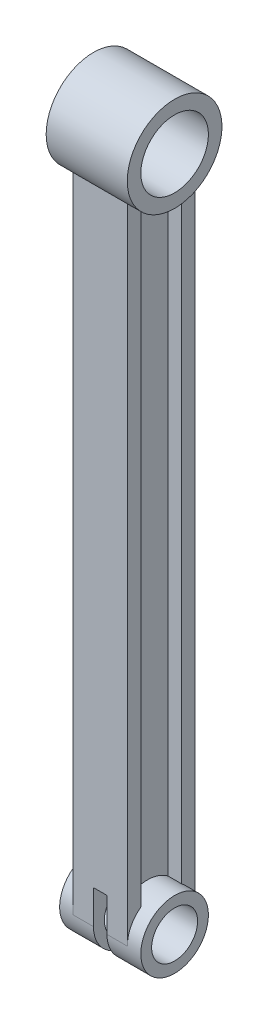
ISO-10303-21;
HEADER;
FILE_DESCRIPTION(('STEP AP214'),'2;1');
FILE_NAME('part.step','',(''),(''),'','','');
FILE_SCHEMA(('AUTOMOTIVE_DESIGN { 1 0 10303 214 1 1 1 1 }'));
ENDSEC;
DATA;
#1=APPLICATION_CONTEXT('core data for automotive mechanical design processes');
#2=APPLICATION_PROTOCOL_DEFINITION('international standard','automotive_design',2000,#1);
#3=PRODUCT_CONTEXT('',#1,'mechanical');
#4=PRODUCT('Part','Part','',(#3));
#5=PRODUCT_RELATED_PRODUCT_CATEGORY('part','',(#4));
#6=PRODUCT_DEFINITION_FORMATION('','',#4);
#7=PRODUCT_DEFINITION_CONTEXT('part definition',#1,'design');
#8=PRODUCT_DEFINITION('design','',#6,#7);
#9=PRODUCT_DEFINITION_SHAPE('','',#8);
#10=(LENGTH_UNIT() NAMED_UNIT(*) SI_UNIT(.MILLI.,.METRE.));
#11=(NAMED_UNIT(*) PLANE_ANGLE_UNIT() SI_UNIT($,.RADIAN.));
#12=(NAMED_UNIT(*) SI_UNIT($,.STERADIAN.) SOLID_ANGLE_UNIT());
#13=UNCERTAINTY_MEASURE_WITH_UNIT(LENGTH_MEASURE(1.E-05),#10,'distance_accuracy_value','');
#14=(GEOMETRIC_REPRESENTATION_CONTEXT(3) GLOBAL_UNCERTAINTY_ASSIGNED_CONTEXT((#13)) GLOBAL_UNIT_ASSIGNED_CONTEXT((#10,
#11,#12)) REPRESENTATION_CONTEXT('',''));
#15=CARTESIAN_POINT('',(0.,0.,0.));
#16=DIRECTION('',(0.,0.,1.));
#17=DIRECTION('',(1.,0.,0.));
#18=AXIS2_PLACEMENT_3D('',#15,#16,#17);
#19=CARTESIAN_POINT('',(-10.,0.,-7.5));
#20=DIRECTION('',(1.,0.,0.));
#21=DIRECTION('',(0.,0.,-1.));
#22=AXIS2_PLACEMENT_3D('',#19,#20,#21);
#23=CYLINDRICAL_SURFACE('',#22,12.5);
#24=CARTESIAN_POINT('',(2.5,0.,-7.5));
#25=DIRECTION('',(-1.,0.,0.));
#26=DIRECTION('',(0.,0.,1.));
#27=AXIS2_PLACEMENT_3D('',#24,#25,#26);
#28=CIRCLE('',#27,12.5);
#29=CARTESIAN_POINT('',(2.5,0.,5.00000000000001));
#30=VERTEX_POINT('',#29);
#31=CARTESIAN_POINT('',(2.5,0.,-20.));
#32=VERTEX_POINT('',#31);
#33=EDGE_CURVE('E298',#30,#32,#28,.F.);
#34=ORIENTED_EDGE('',*,*,#33,.F.);
#35=DIRECTION('',(1.,0.,0.));
#36=VECTOR('',#35,1.);
#37=CARTESIAN_POINT('',(-5.,0.,5.));
#38=LINE('',#37,#36);
#39=CARTESIAN_POINT('',(-5.,0.,5.));
#40=VERTEX_POINT('',#39);
#41=EDGE_CURVE('E263',#40,#30,#38,.T.);
#42=ORIENTED_EDGE('',*,*,#41,.F.);
#43=CARTESIAN_POINT('',(-5.,0.,-7.5));
#44=DIRECTION('',(1.,0.,0.));
#45=DIRECTION('',(0.,0.,-1.));
#46=AXIS2_PLACEMENT_3D('',#43,#44,#45);
#47=CIRCLE('',#46,12.5);
#48=CARTESIAN_POINT('',(-5.,10.,0.));
#49=VERTEX_POINT('',#48);
#50=EDGE_CURVE('E244',#49,#40,#47,.T.);
#51=ORIENTED_EDGE('',*,*,#50,.F.);
#52=DIRECTION('',(1.,0.,0.));
#53=VECTOR('',#52,1.);
#54=CARTESIAN_POINT('',(-10.,10.,0.));
#55=LINE('',#54,#53);
#56=CARTESIAN_POINT('',(0.,10.,0.));
#57=VERTEX_POINT('',#56);
#58=EDGE_CURVE('E241',#57,#49,#55,.F.);
#59=ORIENTED_EDGE('',*,*,#58,.F.);
#60=CARTESIAN_POINT('',(0.,0.,-7.5));
#61=DIRECTION('',(1.,0.,0.));
#62=DIRECTION('',(0.,0.,-1.));
#63=AXIS2_PLACEMENT_3D('',#60,#61,#62);
#64=CIRCLE('',#63,12.5);
#65=CARTESIAN_POINT('',(0.,10.,-15.));
#66=VERTEX_POINT('',#65);
#67=EDGE_CURVE('E238',#66,#57,#64,.T.);
#68=ORIENTED_EDGE('',*,*,#67,.F.);
#69=DIRECTION('',(1.,0.,0.));
#70=VECTOR('',#69,1.);
#71=CARTESIAN_POINT('',(-10.,10.,-15.));
#72=LINE('',#71,#70);
#73=CARTESIAN_POINT('',(-5.,10.,-15.));
#74=VERTEX_POINT('',#73);
#75=EDGE_CURVE('E235',#74,#66,#72,.T.);
#76=ORIENTED_EDGE('',*,*,#75,.F.);
#77=CARTESIAN_POINT('',(-5.,0.,-7.5));
#78=DIRECTION('',(1.,0.,0.));
#79=DIRECTION('',(0.,0.,-1.));
#80=AXIS2_PLACEMENT_3D('',#77,#78,#79);
#81=CIRCLE('',#80,12.5);
#82=CARTESIAN_POINT('',(-5.,0.,-20.));
#83=VERTEX_POINT('',#82);
#84=EDGE_CURVE('E232',#83,#74,#81,.T.);
#85=ORIENTED_EDGE('',*,*,#84,.F.);
#86=DIRECTION('',(-1.,0.,0.));
#87=VECTOR('',#86,1.);
#88=CARTESIAN_POINT('',(-5.,0.,-20.));
#89=LINE('',#88,#87);
#90=EDGE_CURVE('E265',#32,#83,#89,.T.);
#91=ORIENTED_EDGE('',*,*,#90,.F.);
#92=EDGE_LOOP('',(#34,#42,#51,#59,#68,#76,#85,#91));
#93=FACE_BOUND('',#92,.T.);
#94=CARTESIAN_POINT('',(-10.,0.,-7.5));
#95=DIRECTION('',(1.,0.,0.));
#96=DIRECTION('',(0.,0.,-1.));
#97=AXIS2_PLACEMENT_3D('',#94,#95,#96);
#98=CIRCLE('',#97,12.5);
#99=CARTESIAN_POINT('',(-10.,0.,-20.));
#100=VERTEX_POINT('',#99);
#101=EDGE_CURVE('E229',#100,#100,#98,.T.);
#102=ORIENTED_EDGE('',*,*,#101,.T.);
#103=EDGE_LOOP('',(#102));
#104=FACE_BOUND('',#103,.T.);
#105=ADVANCED_FACE('F38',(#93,#104),#23,.T.);
#106=CARTESIAN_POINT('',(-10.,0.,-7.5));
#107=DIRECTION('',(1.,0.,0.));
#108=DIRECTION('',(0.,0.,-1.));
#109=AXIS2_PLACEMENT_3D('',#106,#107,#108);
#110=CYLINDRICAL_SURFACE('',#109,8.5);
#111=CARTESIAN_POINT('',(2.5,0.,-7.5));
#112=DIRECTION('',(-1.,0.,0.));
#113=DIRECTION('',(0.,0.,1.));
#114=AXIS2_PLACEMENT_3D('',#111,#112,#113);
#115=CIRCLE('',#114,8.5);
#116=CARTESIAN_POINT('',(2.5,0.,1.));
#117=VERTEX_POINT('',#116);
#118=EDGE_CURVE('E157',#117,#117,#115,.F.);
#119=ORIENTED_EDGE('',*,*,#118,.T.);
#120=EDGE_LOOP('',(#119));
#121=FACE_BOUND('',#120,.T.);
#122=CARTESIAN_POINT('',(-10.,0.,-7.5));
#123=DIRECTION('',(1.,0.,0.));
#124=DIRECTION('',(0.,0.,-1.));
#125=AXIS2_PLACEMENT_3D('',#122,#123,#124);
#126=CIRCLE('',#125,8.5);
#127=CARTESIAN_POINT('',(-10.,0.,-16.));
#128=VERTEX_POINT('',#127);
#129=EDGE_CURVE('E221',#128,#128,#126,.T.);
#130=ORIENTED_EDGE('',*,*,#129,.F.);
#131=EDGE_LOOP('',(#130));
#132=FACE_BOUND('',#131,.T.);
#133=ADVANCED_FACE('F376',(#121,#132),#110,.F.);
#134=CARTESIAN_POINT('',(-5.,250.,0.));
#135=DIRECTION('',(0.,0.,1.));
#136=DIRECTION('',(1.,0.,0.));
#137=AXIS2_PLACEMENT_3D('',#134,#135,#136);
#138=PLANE('',#137);
#139=DIRECTION('',(0.,-1.,0.));
#140=VECTOR('',#139,1.);
#141=CARTESIAN_POINT('',(-5.,250.,0.));
#142=LINE('',#141,#140);
#143=CARTESIAN_POINT('',(-5.,234.188611699158,0.));
#144=VERTEX_POINT('',#143);
#145=EDGE_CURVE('E293',#144,#49,#142,.T.);
#146=ORIENTED_EDGE('',*,*,#145,.F.);
#147=DIRECTION('',(-1.,0.,0.));
#148=VECTOR('',#147,1.);
#149=CARTESIAN_POINT('',(20.,234.188611699158,0.));
#150=LINE('',#149,#148);
#151=CARTESIAN_POINT('',(0.,234.188611699158,0.));
#152=VERTEX_POINT('',#151);
#153=EDGE_CURVE('E217',#144,#152,#150,.F.);
#154=ORIENTED_EDGE('',*,*,#153,.T.);
#155=DIRECTION('',(0.,-1.,0.));
#156=VECTOR('',#155,1.);
#157=CARTESIAN_POINT('',(0.,250.,0.));
#158=LINE('',#157,#156);
#159=EDGE_CURVE('E269',#152,#57,#158,.T.);
#160=ORIENTED_EDGE('',*,*,#159,.T.);
#161=ORIENTED_EDGE('',*,*,#58,.T.);
#162=EDGE_LOOP('',(#146,#154,#160,#161));
#163=FACE_BOUND('',#162,.T.);
#164=ADVANCED_FACE('F40',(#163),#138,.F.);
#165=CARTESIAN_POINT('',(-5.,250.,0.));
#166=DIRECTION('',(1.,0.,0.));
#167=DIRECTION('',(0.,0.,-1.));
#168=AXIS2_PLACEMENT_3D('',#165,#166,#167);
#169=PLANE('',#168);
#170=DIRECTION('',(0.,-1.,0.));
#171=VECTOR('',#170,1.);
#172=CARTESIAN_POINT('',(-5.,250.,5.));
#173=LINE('',#172,#171);
#174=CARTESIAN_POINT('',(-5.,237.752551286084,5.));
#175=VERTEX_POINT('',#174);
#176=EDGE_CURVE('E291',#175,#40,#173,.T.);
#177=ORIENTED_EDGE('',*,*,#176,.F.);
#178=CARTESIAN_POINT('',(-5.,250.,-7.5));
#179=DIRECTION('',(1.,0.,0.));
#180=DIRECTION('',(0.,0.,-1.));
#181=AXIS2_PLACEMENT_3D('',#178,#179,#180);
#182=CIRCLE('',#181,17.5);
#183=EDGE_CURVE('E214',#175,#144,#182,.T.);
#184=ORIENTED_EDGE('',*,*,#183,.T.);
#185=ORIENTED_EDGE('',*,*,#145,.T.);
#186=ORIENTED_EDGE('',*,*,#50,.T.);
#187=EDGE_LOOP('',(#177,#184,#185,#186));
#188=FACE_BOUND('',#187,.T.);
#189=ADVANCED_FACE('F340',(#188),#169,.F.);
#190=CARTESIAN_POINT('',(-5.,250.,5.));
#191=DIRECTION('',(0.,0.,-1.));
#192=DIRECTION('',(-1.,0.,0.));
#193=AXIS2_PLACEMENT_3D('',#190,#191,#192);
#194=PLANE('',#193);
#195=ORIENTED_EDGE('',*,*,#41,.T.);
#196=DIRECTION('',(0.,1.,0.));
#197=VECTOR('',#196,1.);
#198=CARTESIAN_POINT('',(2.5,250.,5.));
#199=LINE('',#198,#197);
#200=CARTESIAN_POINT('',(2.5,12.5,5.));
#201=VERTEX_POINT('',#200);
#202=EDGE_CURVE('E171',#30,#201,#199,.T.);
#203=ORIENTED_EDGE('',*,*,#202,.T.);
#204=DIRECTION('',(-1.,0.,0.));
#205=VECTOR('',#204,1.);
#206=CARTESIAN_POINT('',(-5.,12.5,5.));
#207=LINE('',#206,#205);
#208=CARTESIAN_POINT('',(7.5,12.5,5.));
#209=VERTEX_POINT('',#208);
#210=EDGE_CURVE('E162',#209,#201,#207,.T.);
#211=ORIENTED_EDGE('',*,*,#210,.F.);
#212=DIRECTION('',(0.,-1.,0.));
#213=VECTOR('',#212,1.);
#214=CARTESIAN_POINT('',(7.5,250.,5.));
#215=LINE('',#214,#213);
#216=CARTESIAN_POINT('',(7.5,0.,5.));
#217=VERTEX_POINT('',#216);
#218=EDGE_CURVE('E149',#209,#217,#215,.T.);
#219=ORIENTED_EDGE('',*,*,#218,.T.);
#220=CARTESIAN_POINT('',(15.,0.,5.));
#221=VERTEX_POINT('',#220);
#222=EDGE_CURVE('E262',#217,#221,#38,.T.);
#223=ORIENTED_EDGE('',*,*,#222,.T.);
#224=DIRECTION('',(0.,-1.,0.));
#225=VECTOR('',#224,1.);
#226=CARTESIAN_POINT('',(15.,250.,5.));
#227=LINE('',#226,#225);
#228=CARTESIAN_POINT('',(15.,237.752551286084,5.));
#229=VERTEX_POINT('',#228);
#230=EDGE_CURVE('E288',#229,#221,#227,.T.);
#231=ORIENTED_EDGE('',*,*,#230,.F.);
#232=DIRECTION('',(-1.,0.,0.));
#233=VECTOR('',#232,1.);
#234=CARTESIAN_POINT('',(20.,237.752551286084,5.));
#235=LINE('',#234,#233);
#236=EDGE_CURVE('E211',#229,#175,#235,.T.);
#237=ORIENTED_EDGE('',*,*,#236,.T.);
#238=ORIENTED_EDGE('',*,*,#176,.T.);
#239=EDGE_LOOP('',(#195,#203,#211,#219,#223,#231,#237,#238));
#240=FACE_BOUND('',#239,.T.);
#241=ADVANCED_FACE('F170',(#240),#194,.F.);
#242=CARTESIAN_POINT('',(15.,250.,0.));
#243=DIRECTION('',(-1.,0.,0.));
#244=DIRECTION('',(0.,0.,1.));
#245=AXIS2_PLACEMENT_3D('',#242,#243,#244);
#246=PLANE('',#245);
#247=DIRECTION('',(0.,-1.,0.));
#248=VECTOR('',#247,1.);
#249=CARTESIAN_POINT('',(15.,250.,0.));
#250=LINE('',#249,#248);
#251=CARTESIAN_POINT('',(15.,234.188611699158,0.));
#252=VERTEX_POINT('',#251);
#253=CARTESIAN_POINT('',(15.,10.,0.));
#254=VERTEX_POINT('',#253);
#255=EDGE_CURVE('E286',#252,#254,#250,.T.);
#256=ORIENTED_EDGE('',*,*,#255,.F.);
#257=CARTESIAN_POINT('',(15.,250.,-7.5));
#258=DIRECTION('',(-1.,0.,0.));
#259=DIRECTION('',(0.,0.,1.));
#260=AXIS2_PLACEMENT_3D('',#257,#258,#259);
#261=CIRCLE('',#260,17.5);
#262=EDGE_CURVE('E208',#252,#229,#261,.T.);
#263=ORIENTED_EDGE('',*,*,#262,.T.);
#264=ORIENTED_EDGE('',*,*,#230,.T.);
#265=CARTESIAN_POINT('',(15.,0.,-7.5));
#266=DIRECTION('',(-1.,0.,0.));
#267=DIRECTION('',(0.,0.,1.));
#268=AXIS2_PLACEMENT_3D('',#265,#266,#267);
#269=CIRCLE('',#268,12.5);
#270=EDGE_CURVE('E247',#221,#254,#269,.T.);
#271=ORIENTED_EDGE('',*,*,#270,.T.);
#272=EDGE_LOOP('',(#256,#263,#264,#271));
#273=FACE_BOUND('',#272,.T.);
#274=ADVANCED_FACE('F335',(#273),#246,.F.);
#275=CARTESIAN_POINT('',(10.,250.,0.));
#276=DIRECTION('',(0.,0.,1.));
#277=DIRECTION('',(1.,0.,0.));
#278=AXIS2_PLACEMENT_3D('',#275,#276,#277);
#279=PLANE('',#278);
#280=DIRECTION('',(0.,-1.,0.));
#281=VECTOR('',#280,1.);
#282=CARTESIAN_POINT('',(10.,250.,0.));
#283=LINE('',#282,#281);
#284=CARTESIAN_POINT('',(10.,234.188611699158,0.));
#285=VERTEX_POINT('',#284);
#286=CARTESIAN_POINT('',(10.,10.,0.));
#287=VERTEX_POINT('',#286);
#288=EDGE_CURVE('E284',#285,#287,#283,.T.);
#289=ORIENTED_EDGE('',*,*,#288,.F.);
#290=DIRECTION('',(-1.,0.,0.));
#291=VECTOR('',#290,1.);
#292=CARTESIAN_POINT('',(20.,234.188611699158,0.));
#293=LINE('',#292,#291);
#294=EDGE_CURVE('E205',#285,#252,#293,.F.);
#295=ORIENTED_EDGE('',*,*,#294,.T.);
#296=ORIENTED_EDGE('',*,*,#255,.T.);
#297=DIRECTION('',(1.,0.,0.));
#298=VECTOR('',#297,1.);
#299=CARTESIAN_POINT('',(-9.99999999999999,10.,0.));
#300=LINE('',#299,#298);
#301=EDGE_CURVE('E250',#254,#287,#300,.F.);
#302=ORIENTED_EDGE('',*,*,#301,.T.);
#303=EDGE_LOOP('',(#289,#295,#296,#302));
#304=FACE_BOUND('',#303,.T.);
#305=ADVANCED_FACE('F331',(#304),#279,.F.);
#306=CARTESIAN_POINT('',(10.,250.,-15.));
#307=DIRECTION('',(-1.,0.,0.));
#308=DIRECTION('',(0.,0.,1.));
#309=AXIS2_PLACEMENT_3D('',#306,#307,#308);
#310=PLANE('',#309);
#311=DIRECTION('',(0.,-1.,0.));
#312=VECTOR('',#311,1.);
#313=CARTESIAN_POINT('',(10.,250.,-15.));
#314=LINE('',#313,#312);
#315=CARTESIAN_POINT('',(10.,234.188611699158,-15.));
#316=VERTEX_POINT('',#315);
#317=CARTESIAN_POINT('',(10.,10.,-15.));
#318=VERTEX_POINT('',#317);
#319=EDGE_CURVE('E282',#316,#318,#314,.T.);
#320=ORIENTED_EDGE('',*,*,#319,.F.);
#321=CARTESIAN_POINT('',(10.,250.,-7.5));
#322=DIRECTION('',(-1.,0.,0.));
#323=DIRECTION('',(0.,0.,1.));
#324=AXIS2_PLACEMENT_3D('',#321,#322,#323);
#325=CIRCLE('',#324,17.5);
#326=EDGE_CURVE('E202',#316,#285,#325,.T.);
#327=ORIENTED_EDGE('',*,*,#326,.T.);
#328=ORIENTED_EDGE('',*,*,#288,.T.);
#329=CARTESIAN_POINT('',(10.,0.,-7.5));
#330=DIRECTION('',(-1.,0.,0.));
#331=DIRECTION('',(0.,0.,1.));
#332=AXIS2_PLACEMENT_3D('',#329,#330,#331);
#333=CIRCLE('',#332,12.5);
#334=EDGE_CURVE('E253',#287,#318,#333,.T.);
#335=ORIENTED_EDGE('',*,*,#334,.T.);
#336=EDGE_LOOP('',(#320,#327,#328,#335));
#337=FACE_BOUND('',#336,.T.);
#338=ADVANCED_FACE('F328',(#337),#310,.F.);
#339=CARTESIAN_POINT('',(10.,250.,-15.));
#340=DIRECTION('',(0.,0.,-1.));
#341=DIRECTION('',(-1.,0.,0.));
#342=AXIS2_PLACEMENT_3D('',#339,#340,#341);
#343=PLANE('',#342);
#344=DIRECTION('',(0.,-1.,0.));
#345=VECTOR('',#344,1.);
#346=CARTESIAN_POINT('',(15.,250.,-15.));
#347=LINE('',#346,#345);
#348=CARTESIAN_POINT('',(15.,234.188611699158,-15.));
#349=VERTEX_POINT('',#348);
#350=CARTESIAN_POINT('',(15.,10.,-15.));
#351=VERTEX_POINT('',#350);
#352=EDGE_CURVE('E280',#349,#351,#347,.T.);
#353=ORIENTED_EDGE('',*,*,#352,.F.);
#354=DIRECTION('',(-1.,0.,0.));
#355=VECTOR('',#354,1.);
#356=CARTESIAN_POINT('',(20.,234.188611699158,-15.));
#357=LINE('',#356,#355);
#358=EDGE_CURVE('E199',#349,#316,#357,.T.);
#359=ORIENTED_EDGE('',*,*,#358,.T.);
#360=ORIENTED_EDGE('',*,*,#319,.T.);
#361=DIRECTION('',(1.,0.,0.));
#362=VECTOR('',#361,1.);
#363=CARTESIAN_POINT('',(-10.,10.,-15.));
#364=LINE('',#363,#362);
#365=EDGE_CURVE('E256',#318,#351,#364,.T.);
#366=ORIENTED_EDGE('',*,*,#365,.T.);
#367=EDGE_LOOP('',(#353,#359,#360,#366));
#368=FACE_BOUND('',#367,.T.);
#369=ADVANCED_FACE('F323',(#368),#343,.F.);
#370=CARTESIAN_POINT('',(15.,250.,-15.));
#371=DIRECTION('',(-1.,0.,0.));
#372=DIRECTION('',(0.,0.,1.));
#373=AXIS2_PLACEMENT_3D('',#370,#371,#372);
#374=PLANE('',#373);
#375=DIRECTION('',(0.,-1.,0.));
#376=VECTOR('',#375,1.);
#377=CARTESIAN_POINT('',(15.,250.,-20.));
#378=LINE('',#377,#376);
#379=CARTESIAN_POINT('',(15.,237.752551286084,-20.));
#380=VERTEX_POINT('',#379);
#381=CARTESIAN_POINT('',(15.,0.,-20.));
#382=VERTEX_POINT('',#381);
#383=EDGE_CURVE('E278',#380,#382,#378,.T.);
#384=ORIENTED_EDGE('',*,*,#383,.F.);
#385=CARTESIAN_POINT('',(15.,250.,-7.5));
#386=DIRECTION('',(-1.,0.,0.));
#387=DIRECTION('',(0.,0.,1.));
#388=AXIS2_PLACEMENT_3D('',#385,#386,#387);
#389=CIRCLE('',#388,17.5);
#390=EDGE_CURVE('E196',#380,#349,#389,.T.);
#391=ORIENTED_EDGE('',*,*,#390,.T.);
#392=ORIENTED_EDGE('',*,*,#352,.T.);
#393=CARTESIAN_POINT('',(15.,0.,-7.5));
#394=DIRECTION('',(-1.,0.,0.));
#395=DIRECTION('',(0.,0.,1.));
#396=AXIS2_PLACEMENT_3D('',#393,#394,#395);
#397=CIRCLE('',#396,12.5);
#398=EDGE_CURVE('E259',#351,#382,#397,.T.);
#399=ORIENTED_EDGE('',*,*,#398,.T.);
#400=EDGE_LOOP('',(#384,#391,#392,#399));
#401=FACE_BOUND('',#400,.T.);
#402=ADVANCED_FACE('F320',(#401),#374,.F.);
#403=CARTESIAN_POINT('',(-5.,250.,-20.));
#404=DIRECTION('',(0.,0.,1.));
#405=DIRECTION('',(1.,0.,0.));
#406=AXIS2_PLACEMENT_3D('',#403,#404,#405);
#407=PLANE('',#406);
#408=DIRECTION('',(1.,0.,0.));
#409=VECTOR('',#408,1.);
#410=CARTESIAN_POINT('',(-5.,12.5,-20.));
#411=LINE('',#410,#409);
#412=CARTESIAN_POINT('',(2.5,12.5,-20.));
#413=VERTEX_POINT('',#412);
#414=CARTESIAN_POINT('',(7.5,12.5,-20.));
#415=VERTEX_POINT('',#414);
#416=EDGE_CURVE('E11',#413,#415,#411,.T.);
#417=ORIENTED_EDGE('',*,*,#416,.F.);
#418=DIRECTION('',(0.,-1.,0.));
#419=VECTOR('',#418,1.);
#420=CARTESIAN_POINT('',(2.5,250.,-20.));
#421=LINE('',#420,#419);
#422=EDGE_CURVE('E177',#413,#32,#421,.T.);
#423=ORIENTED_EDGE('',*,*,#422,.T.);
#424=ORIENTED_EDGE('',*,*,#90,.T.);
#425=DIRECTION('',(0.,-1.,0.));
#426=VECTOR('',#425,1.);
#427=CARTESIAN_POINT('',(-5.,250.,-20.));
#428=LINE('',#427,#426);
#429=CARTESIAN_POINT('',(-5.,237.752551286084,-20.));
#430=VERTEX_POINT('',#429);
#431=EDGE_CURVE('E275',#430,#83,#428,.T.);
#432=ORIENTED_EDGE('',*,*,#431,.F.);
#433=DIRECTION('',(-1.,0.,0.));
#434=VECTOR('',#433,1.);
#435=CARTESIAN_POINT('',(20.,237.752551286084,-20.));
#436=LINE('',#435,#434);
#437=EDGE_CURVE('E193',#430,#380,#436,.F.);
#438=ORIENTED_EDGE('',*,*,#437,.T.);
#439=ORIENTED_EDGE('',*,*,#383,.T.);
#440=CARTESIAN_POINT('',(7.5,0.,-20.));
#441=VERTEX_POINT('',#440);
#442=EDGE_CURVE('E266',#382,#441,#89,.T.);
#443=ORIENTED_EDGE('',*,*,#442,.T.);
#444=DIRECTION('',(0.,1.,0.));
#445=VECTOR('',#444,1.);
#446=CARTESIAN_POINT('',(7.5,250.,-20.));
#447=LINE('',#446,#445);
#448=EDGE_CURVE('E53',#441,#415,#447,.T.);
#449=ORIENTED_EDGE('',*,*,#448,.T.);
#450=EDGE_LOOP('',(#417,#423,#424,#432,#438,#439,#443,#449));
#451=FACE_BOUND('',#450,.T.);
#452=ADVANCED_FACE('F310',(#451),#407,.F.);
#453=CARTESIAN_POINT('',(-5.,250.,-15.));
#454=DIRECTION('',(1.,0.,0.));
#455=DIRECTION('',(0.,0.,-1.));
#456=AXIS2_PLACEMENT_3D('',#453,#454,#455);
#457=PLANE('',#456);
#458=DIRECTION('',(0.,-1.,0.));
#459=VECTOR('',#458,1.);
#460=CARTESIAN_POINT('',(-5.,250.,-15.));
#461=LINE('',#460,#459);
#462=CARTESIAN_POINT('',(-5.,234.188611699158,-15.));
#463=VERTEX_POINT('',#462);
#464=EDGE_CURVE('E273',#463,#74,#461,.T.);
#465=ORIENTED_EDGE('',*,*,#464,.F.);
#466=CARTESIAN_POINT('',(-5.,250.,-7.5));
#467=DIRECTION('',(1.,0.,0.));
#468=DIRECTION('',(0.,0.,-1.));
#469=AXIS2_PLACEMENT_3D('',#466,#467,#468);
#470=CIRCLE('',#469,17.5);
#471=EDGE_CURVE('E190',#463,#430,#470,.T.);
#472=ORIENTED_EDGE('',*,*,#471,.T.);
#473=ORIENTED_EDGE('',*,*,#431,.T.);
#474=ORIENTED_EDGE('',*,*,#84,.T.);
#475=EDGE_LOOP('',(#465,#472,#473,#474));
#476=FACE_BOUND('',#475,.T.);
#477=ADVANCED_FACE('F358',(#476),#457,.F.);
#478=CARTESIAN_POINT('',(-5.,250.,-15.));
#479=DIRECTION('',(0.,0.,-1.));
#480=DIRECTION('',(-1.,0.,0.));
#481=AXIS2_PLACEMENT_3D('',#478,#479,#480);
#482=PLANE('',#481);
#483=DIRECTION('',(0.,-1.,0.));
#484=VECTOR('',#483,1.);
#485=CARTESIAN_POINT('',(0.,250.,-15.));
#486=LINE('',#485,#484);
#487=CARTESIAN_POINT('',(0.,234.188611699158,-15.));
#488=VERTEX_POINT('',#487);
#489=EDGE_CURVE('E271',#488,#66,#486,.T.);
#490=ORIENTED_EDGE('',*,*,#489,.F.);
#491=DIRECTION('',(-1.,0.,0.));
#492=VECTOR('',#491,1.);
#493=CARTESIAN_POINT('',(20.,234.188611699158,-15.));
#494=LINE('',#493,#492);
#495=EDGE_CURVE('E61',#488,#463,#494,.T.);
#496=ORIENTED_EDGE('',*,*,#495,.T.);
#497=ORIENTED_EDGE('',*,*,#464,.T.);
#498=ORIENTED_EDGE('',*,*,#75,.T.);
#499=EDGE_LOOP('',(#490,#496,#497,#498));
#500=FACE_BOUND('',#499,.T.);
#501=ADVANCED_FACE('F355',(#500),#482,.F.);
#502=CARTESIAN_POINT('',(0.,250.,0.));
#503=DIRECTION('',(1.,0.,0.));
#504=DIRECTION('',(0.,0.,-1.));
#505=AXIS2_PLACEMENT_3D('',#502,#503,#504);
#506=PLANE('',#505);
#507=ORIENTED_EDGE('',*,*,#159,.F.);
#508=CARTESIAN_POINT('',(0.,250.,-7.5));
#509=DIRECTION('',(1.,0.,0.));
#510=DIRECTION('',(0.,0.,-1.));
#511=AXIS2_PLACEMENT_3D('',#508,#509,#510);
#512=CIRCLE('',#511,17.5);
#513=EDGE_CURVE('E46',#152,#488,#512,.T.);
#514=ORIENTED_EDGE('',*,*,#513,.T.);
#515=ORIENTED_EDGE('',*,*,#489,.T.);
#516=ORIENTED_EDGE('',*,*,#67,.T.);
#517=EDGE_LOOP('',(#507,#514,#515,#516));
#518=FACE_BOUND('',#517,.T.);
#519=ADVANCED_FACE('F350',(#518),#506,.F.);
#520=CARTESIAN_POINT('',(7.5,0.,-7.5));
#521=DIRECTION('',(1.,0.,0.));
#522=DIRECTION('',(0.,0.,-1.));
#523=AXIS2_PLACEMENT_3D('',#520,#521,#522);
#524=CIRCLE('',#523,12.5);
#525=EDGE_CURVE('E153',#441,#217,#524,.F.);
#526=ORIENTED_EDGE('',*,*,#525,.F.);
#527=ORIENTED_EDGE('',*,*,#442,.F.);
#528=ORIENTED_EDGE('',*,*,#398,.F.);
#529=ORIENTED_EDGE('',*,*,#365,.F.);
#530=ORIENTED_EDGE('',*,*,#334,.F.);
#531=ORIENTED_EDGE('',*,*,#301,.F.);
#532=ORIENTED_EDGE('',*,*,#270,.F.);
#533=ORIENTED_EDGE('',*,*,#222,.F.);
#534=EDGE_LOOP('',(#526,#527,#528,#529,#530,#531,#532,#533));
#535=FACE_BOUND('',#534,.T.);
#536=CARTESIAN_POINT('',(20.,0.,-7.5));
#537=DIRECTION('',(1.,0.,0.));
#538=DIRECTION('',(0.,0.,-1.));
#539=AXIS2_PLACEMENT_3D('',#536,#537,#538);
#540=CIRCLE('',#539,12.5);
#541=CARTESIAN_POINT('',(20.,0.,-20.));
#542=VERTEX_POINT('',#541);
#543=EDGE_CURVE('E224',#542,#542,#540,.T.);
#544=ORIENTED_EDGE('',*,*,#543,.F.);
#545=EDGE_LOOP('',(#544));
#546=FACE_BOUND('',#545,.T.);
#547=ADVANCED_FACE('F316',(#535,#546),#23,.T.);
#548=CARTESIAN_POINT('',(-10.,0.,-7.5));
#549=DIRECTION('',(1.,0.,0.));
#550=DIRECTION('',(0.,0.,-1.));
#551=AXIS2_PLACEMENT_3D('',#548,#549,#550);
#552=PLANE('',#551);
#553=ORIENTED_EDGE('',*,*,#129,.T.);
#554=EDGE_LOOP('',(#553));
#555=FACE_BOUND('',#554,.T.);
#556=ORIENTED_EDGE('',*,*,#101,.F.);
#557=EDGE_LOOP('',(#556));
#558=FACE_BOUND('',#557,.T.);
#559=ADVANCED_FACE('F387',(#555,#558),#552,.F.);
#560=CARTESIAN_POINT('',(20.,0.,-7.5));
#561=DIRECTION('',(1.,0.,0.));
#562=DIRECTION('',(0.,0.,-1.));
#563=AXIS2_PLACEMENT_3D('',#560,#561,#562);
#564=PLANE('',#563);
#565=CARTESIAN_POINT('',(20.,0.,-7.5));
#566=DIRECTION('',(1.,0.,0.));
#567=DIRECTION('',(0.,0.,-1.));
#568=AXIS2_PLACEMENT_3D('',#565,#566,#567);
#569=CIRCLE('',#568,8.5);
#570=CARTESIAN_POINT('',(20.,0.,-16.));
#571=VERTEX_POINT('',#570);
#572=EDGE_CURVE('E220',#571,#571,#569,.T.);
#573=ORIENTED_EDGE('',*,*,#572,.F.);
#574=EDGE_LOOP('',(#573));
#575=FACE_BOUND('',#574,.T.);
#576=ORIENTED_EDGE('',*,*,#543,.T.);
#577=EDGE_LOOP('',(#576));
#578=FACE_BOUND('',#577,.T.);
#579=ADVANCED_FACE('F373',(#575,#578),#564,.T.);
#580=CARTESIAN_POINT('',(7.5,0.,-7.5));
#581=DIRECTION('',(1.,0.,0.));
#582=DIRECTION('',(0.,0.,-1.));
#583=AXIS2_PLACEMENT_3D('',#580,#581,#582);
#584=CIRCLE('',#583,8.5);
#585=CARTESIAN_POINT('',(7.5,0.,-16.));
#586=VERTEX_POINT('',#585);
#587=EDGE_CURVE('E165',#586,#586,#584,.F.);
#588=ORIENTED_EDGE('',*,*,#587,.T.);
#589=EDGE_LOOP('',(#588));
#590=FACE_BOUND('',#589,.T.);
#591=ORIENTED_EDGE('',*,*,#572,.T.);
#592=EDGE_LOOP('',(#591));
#593=FACE_BOUND('',#592,.T.);
#594=ADVANCED_FACE('F363',(#590,#593),#110,.F.);
#595=CARTESIAN_POINT('',(20.,250.,-7.5));
#596=DIRECTION('',(-1.,0.,0.));
#597=DIRECTION('',(0.,0.,1.));
#598=AXIS2_PLACEMENT_3D('',#595,#596,#597);
#599=CYLINDRICAL_SURFACE('',#598,17.5);
#600=CARTESIAN_POINT('',(-10.,250.,-7.5));
#601=DIRECTION('',(-1.,0.,0.));
#602=DIRECTION('',(0.,0.,1.));
#603=AXIS2_PLACEMENT_3D('',#600,#601,#602);
#604=CIRCLE('',#603,17.5);
#605=CARTESIAN_POINT('',(-10.,250.,10.));
#606=VERTEX_POINT('',#605);
#607=EDGE_CURVE('E182',#606,#606,#604,.T.);
#608=ORIENTED_EDGE('',*,*,#607,.F.);
#609=EDGE_LOOP('',(#608));
#610=FACE_BOUND('',#609,.T.);
#611=CARTESIAN_POINT('',(20.,250.,-7.5));
#612=DIRECTION('',(-1.,0.,0.));
#613=DIRECTION('',(0.,0.,1.));
#614=AXIS2_PLACEMENT_3D('',#611,#612,#613);
#615=CIRCLE('',#614,17.5);
#616=CARTESIAN_POINT('',(20.,250.,10.));
#617=VERTEX_POINT('',#616);
#618=EDGE_CURVE('E186',#617,#617,#615,.T.);
#619=ORIENTED_EDGE('',*,*,#618,.T.);
#620=EDGE_LOOP('',(#619));
#621=FACE_BOUND('',#620,.T.);
#622=ORIENTED_EDGE('',*,*,#153,.F.);
#623=ORIENTED_EDGE('',*,*,#183,.F.);
#624=ORIENTED_EDGE('',*,*,#236,.F.);
#625=ORIENTED_EDGE('',*,*,#262,.F.);
#626=ORIENTED_EDGE('',*,*,#294,.F.);
#627=ORIENTED_EDGE('',*,*,#326,.F.);
#628=ORIENTED_EDGE('',*,*,#358,.F.);
#629=ORIENTED_EDGE('',*,*,#390,.F.);
#630=ORIENTED_EDGE('',*,*,#437,.F.);
#631=ORIENTED_EDGE('',*,*,#471,.F.);
#632=ORIENTED_EDGE('',*,*,#495,.F.);
#633=ORIENTED_EDGE('',*,*,#513,.F.);
#634=EDGE_LOOP('',(#622,#623,#624,#625,#626,#627,#628,#629,#630,#631,#632,#633));
#635=FACE_BOUND('',#634,.T.);
#636=ADVANCED_FACE('F360',(#610,#621,#635),#599,.T.);
#637=CARTESIAN_POINT('',(20.,250.,-7.5));
#638=DIRECTION('',(-1.,0.,0.));
#639=DIRECTION('',(0.,0.,1.));
#640=AXIS2_PLACEMENT_3D('',#637,#638,#639);
#641=PLANE('',#640);
#642=CARTESIAN_POINT('',(20.,250.,-7.5));
#643=DIRECTION('',(1.,0.,0.));
#644=DIRECTION('',(0.,0.,-1.));
#645=AXIS2_PLACEMENT_3D('',#642,#643,#644);
#646=CIRCLE('',#645,12.5);
#647=CARTESIAN_POINT('',(20.,250.,-20.));
#648=VERTEX_POINT('',#647);
#649=EDGE_CURVE('E172',#648,#648,#646,.T.);
#650=ORIENTED_EDGE('',*,*,#649,.F.);
#651=EDGE_LOOP('',(#650));
#652=FACE_BOUND('',#651,.T.);
#653=ORIENTED_EDGE('',*,*,#618,.F.);
#654=EDGE_LOOP('',(#653));
#655=FACE_BOUND('',#654,.T.);
#656=ADVANCED_FACE('F362',(#652,#655),#641,.F.);
#657=CARTESIAN_POINT('',(-10.,250.,-7.5));
#658=DIRECTION('',(-1.,0.,0.));
#659=DIRECTION('',(0.,0.,1.));
#660=AXIS2_PLACEMENT_3D('',#657,#658,#659);
#661=PLANE('',#660);
#662=CARTESIAN_POINT('',(-10.,250.,-7.5));
#663=DIRECTION('',(1.,0.,0.));
#664=DIRECTION('',(0.,0.,-1.));
#665=AXIS2_PLACEMENT_3D('',#662,#663,#664);
#666=CIRCLE('',#665,12.5);
#667=CARTESIAN_POINT('',(-10.,250.,-20.));
#668=VERTEX_POINT('',#667);
#669=EDGE_CURVE('E175',#668,#668,#666,.T.);
#670=ORIENTED_EDGE('',*,*,#669,.T.);
#671=EDGE_LOOP('',(#670));
#672=FACE_BOUND('',#671,.T.);
#673=ORIENTED_EDGE('',*,*,#607,.T.);
#674=EDGE_LOOP('',(#673));
#675=FACE_BOUND('',#674,.T.);
#676=ADVANCED_FACE('F370',(#672,#675),#661,.T.);
#677=CARTESIAN_POINT('',(-10.,250.,-7.5));
#678=DIRECTION('',(1.,0.,0.));
#679=DIRECTION('',(0.,0.,-1.));
#680=AXIS2_PLACEMENT_3D('',#677,#678,#679);
#681=CYLINDRICAL_SURFACE('',#680,12.5);
#682=ORIENTED_EDGE('',*,*,#669,.F.);
#683=EDGE_LOOP('',(#682));
#684=FACE_BOUND('',#683,.T.);
#685=ORIENTED_EDGE('',*,*,#649,.T.);
#686=EDGE_LOOP('',(#685));
#687=FACE_BOUND('',#686,.T.);
#688=ADVANCED_FACE('F468',(#684,#687),#681,.F.);
#689=CARTESIAN_POINT('',(0.,12.5,0.));
#690=DIRECTION('',(0.,-1.,0.));
#691=DIRECTION('',(0.,0.,-1.));
#692=AXIS2_PLACEMENT_3D('',#689,#690,#691);
#693=PLANE('',#692);
#694=ORIENTED_EDGE('',*,*,#210,.T.);
#695=DIRECTION('',(0.,0.,1.));
#696=VECTOR('',#695,1.);
#697=CARTESIAN_POINT('',(2.5,12.5,15.));
#698=LINE('',#697,#696);
#699=EDGE_CURVE('E166',#413,#201,#698,.T.);
#700=ORIENTED_EDGE('',*,*,#699,.F.);
#701=ORIENTED_EDGE('',*,*,#416,.T.);
#702=DIRECTION('',(0.,0.,-1.));
#703=VECTOR('',#702,1.);
#704=CARTESIAN_POINT('',(7.5,12.5,15.));
#705=LINE('',#704,#703);
#706=EDGE_CURVE('E152',#209,#415,#705,.T.);
#707=ORIENTED_EDGE('',*,*,#706,.F.);
#708=EDGE_LOOP('',(#694,#700,#701,#707));
#709=FACE_BOUND('',#708,.T.);
#710=ADVANCED_FACE('F160',(#709),#693,.T.);
#711=CARTESIAN_POINT('',(2.5,-26.5,15.));
#712=DIRECTION('',(-1.,0.,0.));
#713=DIRECTION('',(0.,0.,1.));
#714=AXIS2_PLACEMENT_3D('',#711,#712,#713);
#715=PLANE('',#714);
#716=ORIENTED_EDGE('',*,*,#118,.F.);
#717=EDGE_LOOP('',(#716));
#718=FACE_BOUND('',#717,.T.);
#719=ORIENTED_EDGE('',*,*,#33,.T.);
#720=ORIENTED_EDGE('',*,*,#422,.F.);
#721=ORIENTED_EDGE('',*,*,#699,.T.);
#722=ORIENTED_EDGE('',*,*,#202,.F.);
#723=EDGE_LOOP('',(#719,#720,#721,#722));
#724=FACE_BOUND('',#723,.T.);
#725=ADVANCED_FACE('F308',(#718,#724),#715,.F.);
#726=CARTESIAN_POINT('',(7.5,-26.5,15.));
#727=DIRECTION('',(1.,0.,0.));
#728=DIRECTION('',(0.,0.,-1.));
#729=AXIS2_PLACEMENT_3D('',#726,#727,#728);
#730=PLANE('',#729);
#731=ORIENTED_EDGE('',*,*,#587,.F.);
#732=EDGE_LOOP('',(#731));
#733=FACE_BOUND('',#732,.T.);
#734=ORIENTED_EDGE('',*,*,#706,.T.);
#735=ORIENTED_EDGE('',*,*,#448,.F.);
#736=ORIENTED_EDGE('',*,*,#525,.T.);
#737=ORIENTED_EDGE('',*,*,#218,.F.);
#738=EDGE_LOOP('',(#734,#735,#736,#737));
#739=FACE_BOUND('',#738,.T.);
#740=ADVANCED_FACE('F151',(#733,#739),#730,.F.);
#741=CLOSED_SHELL('',(#105,#133,#164,#189,#241,#274,#305,#338,#369,#402,#452,#477,#501,#519,
#547,#559,#579,#594,#636,#656,#676,#688,#710,#725,#740));
#742=MANIFOLD_SOLID_BREP('B2',#741);
#743=ADVANCED_BREP_SHAPE_REPRESENTATION('',(#18,#742),#14);
#744=SHAPE_DEFINITION_REPRESENTATION(#9,#743);
ENDSEC;
END-ISO-10303-21;
